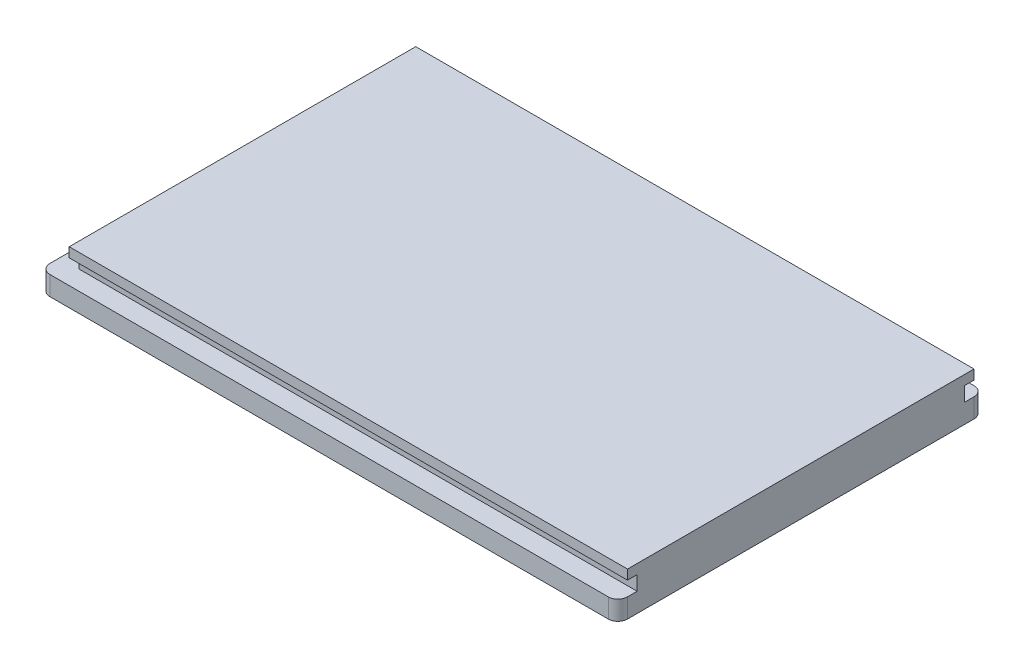
ISO-10303-21;
HEADER;
FILE_DESCRIPTION(('STEP AP214'),'2;1');
FILE_NAME('part.step','',(''),(''),'','','');
FILE_SCHEMA(('AUTOMOTIVE_DESIGN { 1 0 10303 214 1 1 1 1 }'));
ENDSEC;
DATA;
#1=APPLICATION_CONTEXT('core data for automotive mechanical design processes');
#2=APPLICATION_PROTOCOL_DEFINITION('international standard','automotive_design',2000,#1);
#3=PRODUCT_CONTEXT('',#1,'mechanical');
#4=PRODUCT('Part','Part','',(#3));
#5=PRODUCT_RELATED_PRODUCT_CATEGORY('part','',(#4));
#6=PRODUCT_DEFINITION_FORMATION('','',#4);
#7=PRODUCT_DEFINITION_CONTEXT('part definition',#1,'design');
#8=PRODUCT_DEFINITION('design','',#6,#7);
#9=PRODUCT_DEFINITION_SHAPE('','',#8);
#10=(LENGTH_UNIT() NAMED_UNIT(*) SI_UNIT(.MILLI.,.METRE.));
#11=(NAMED_UNIT(*) PLANE_ANGLE_UNIT() SI_UNIT($,.RADIAN.));
#12=(NAMED_UNIT(*) SI_UNIT($,.STERADIAN.) SOLID_ANGLE_UNIT());
#13=UNCERTAINTY_MEASURE_WITH_UNIT(LENGTH_MEASURE(1.E-05),#10,'distance_accuracy_value','');
#14=(GEOMETRIC_REPRESENTATION_CONTEXT(3) GLOBAL_UNCERTAINTY_ASSIGNED_CONTEXT((#13)) GLOBAL_UNIT_ASSIGNED_CONTEXT((#10,
#11,#12)) REPRESENTATION_CONTEXT('',''));
#15=CARTESIAN_POINT('',(0.,0.,0.));
#16=DIRECTION('',(0.,0.,1.));
#17=DIRECTION('',(1.,0.,0.));
#18=AXIS2_PLACEMENT_3D('',#15,#16,#17);
#19=CARTESIAN_POINT('',(0.,5.,0.));
#20=DIRECTION('',(0.,-1.,0.));
#21=DIRECTION('',(0.,0.,-1.));
#22=AXIS2_PLACEMENT_3D('',#19,#20,#21);
#23=PLANE('',#22);
#24=DIRECTION('',(1.,0.,0.));
#25=VECTOR('',#24,1.);
#26=CARTESIAN_POINT('',(0.,5.,0.));
#27=LINE('',#26,#25);
#28=CARTESIAN_POINT('',(2.5,5.,0.));
#29=VERTEX_POINT('',#28);
#30=CARTESIAN_POINT('',(147.5,5.,0.));
#31=VERTEX_POINT('',#30);
#32=EDGE_CURVE('E207',#29,#31,#27,.T.);
#33=ORIENTED_EDGE('',*,*,#32,.T.);
#34=CARTESIAN_POINT('',(147.5,5.,-2.5));
#35=DIRECTION('',(0.,-1.,0.));
#36=DIRECTION('',(0.,0.,-1.));
#37=AXIS2_PLACEMENT_3D('',#34,#35,#36);
#38=CIRCLE('',#37,2.5);
#39=CARTESIAN_POINT('',(150.,5.,-2.5));
#40=VERTEX_POINT('',#39);
#41=EDGE_CURVE('E248',#31,#40,#38,.F.);
#42=ORIENTED_EDGE('',*,*,#41,.T.);
#43=DIRECTION('',(0.,0.,-1.));
#44=VECTOR('',#43,1.);
#45=CARTESIAN_POINT('',(150.,5.,0.));
#46=LINE('',#45,#44);
#47=CARTESIAN_POINT('',(150.,5.,-5.00000000000001));
#48=VERTEX_POINT('',#47);
#49=EDGE_CURVE('E212',#40,#48,#46,.T.);
#50=ORIENTED_EDGE('',*,*,#49,.T.);
#51=DIRECTION('',(1.,0.,0.));
#52=VECTOR('',#51,1.);
#53=CARTESIAN_POINT('',(150.,5.,-5.00000000000001));
#54=LINE('',#53,#52);
#55=CARTESIAN_POINT('',(5.,5.,-5.00000000000001));
#56=VERTEX_POINT('',#55);
#57=EDGE_CURVE('E175',#56,#48,#54,.T.);
#58=ORIENTED_EDGE('',*,*,#57,.F.);
#59=DIRECTION('',(0.,0.,1.));
#60=VECTOR('',#59,1.);
#61=CARTESIAN_POINT('',(5.,5.,-90.));
#62=LINE('',#61,#60);
#63=CARTESIAN_POINT('',(5.,5.,-90.));
#64=VERTEX_POINT('',#63);
#65=EDGE_CURVE('E173',#64,#56,#62,.T.);
#66=ORIENTED_EDGE('',*,*,#65,.F.);
#67=DIRECTION('',(-1.,0.,0.));
#68=VECTOR('',#67,1.);
#69=CARTESIAN_POINT('',(5.,5.,-90.));
#70=LINE('',#69,#68);
#71=CARTESIAN_POINT('',(150.,5.,-90.));
#72=VERTEX_POINT('',#71);
#73=EDGE_CURVE('E185',#72,#64,#70,.T.);
#74=ORIENTED_EDGE('',*,*,#73,.F.);
#75=CARTESIAN_POINT('',(150.,5.,-92.5));
#76=VERTEX_POINT('',#75);
#77=EDGE_CURVE('E211',#72,#76,#46,.T.);
#78=ORIENTED_EDGE('',*,*,#77,.T.);
#79=CARTESIAN_POINT('',(147.5,5.,-92.5));
#80=DIRECTION('',(0.,-1.,0.));
#81=DIRECTION('',(0.,0.,-1.));
#82=AXIS2_PLACEMENT_3D('',#79,#80,#81);
#83=CIRCLE('',#82,2.5);
#84=CARTESIAN_POINT('',(147.5,5.,-95.));
#85=VERTEX_POINT('',#84);
#86=EDGE_CURVE('E246',#76,#85,#83,.F.);
#87=ORIENTED_EDGE('',*,*,#86,.T.);
#88=DIRECTION('',(-1.,0.,0.));
#89=VECTOR('',#88,1.);
#90=CARTESIAN_POINT('',(0.,5.,-95.));
#91=LINE('',#90,#89);
#92=CARTESIAN_POINT('',(2.5,5.,-95.));
#93=VERTEX_POINT('',#92);
#94=EDGE_CURVE('E214',#85,#93,#91,.T.);
#95=ORIENTED_EDGE('',*,*,#94,.T.);
#96=CARTESIAN_POINT('',(2.5,5.,-92.5));
#97=DIRECTION('',(0.,-1.,0.));
#98=DIRECTION('',(0.,0.,-1.));
#99=AXIS2_PLACEMENT_3D('',#96,#97,#98);
#100=CIRCLE('',#99,2.5);
#101=CARTESIAN_POINT('',(0.,5.,-92.5));
#102=VERTEX_POINT('',#101);
#103=EDGE_CURVE('E53',#93,#102,#100,.F.);
#104=ORIENTED_EDGE('',*,*,#103,.T.);
#105=DIRECTION('',(0.,0.,1.));
#106=VECTOR('',#105,1.);
#107=CARTESIAN_POINT('',(0.,5.,0.));
#108=LINE('',#107,#106);
#109=CARTESIAN_POINT('',(0.,5.,-2.5));
#110=VERTEX_POINT('',#109);
#111=EDGE_CURVE('E205',#102,#110,#108,.T.);
#112=ORIENTED_EDGE('',*,*,#111,.T.);
#113=CARTESIAN_POINT('',(2.5,5.,-2.5));
#114=DIRECTION('',(0.,-1.,0.));
#115=DIRECTION('',(0.,0.,-1.));
#116=AXIS2_PLACEMENT_3D('',#113,#114,#115);
#117=CIRCLE('',#116,2.5);
#118=EDGE_CURVE('E244',#110,#29,#117,.F.);
#119=ORIENTED_EDGE('',*,*,#118,.T.);
#120=EDGE_LOOP('',(#33,#42,#50,#58,#66,#74,#78,#87,#95,#104,#112,#119));
#121=FACE_BOUND('',#120,.T.);
#122=ADVANCED_FACE('F33',(#121),#23,.F.);
#123=CARTESIAN_POINT('',(0.,5.,0.));
#124=DIRECTION('',(1.,0.,0.));
#125=DIRECTION('',(0.,0.,-1.));
#126=AXIS2_PLACEMENT_3D('',#123,#124,#125);
#127=PLANE('',#126);
#128=DIRECTION('',(0.,0.,1.));
#129=VECTOR('',#128,1.);
#130=CARTESIAN_POINT('',(0.,0.,0.));
#131=LINE('',#130,#129);
#132=CARTESIAN_POINT('',(0.,0.,-92.5));
#133=VERTEX_POINT('',#132);
#134=CARTESIAN_POINT('',(0.,0.,-2.5));
#135=VERTEX_POINT('',#134);
#136=EDGE_CURVE('E204',#133,#135,#131,.T.);
#137=ORIENTED_EDGE('',*,*,#136,.T.);
#138=DIRECTION('',(0.,-1.,0.));
#139=VECTOR('',#138,1.);
#140=CARTESIAN_POINT('',(0.,5.,-2.5));
#141=LINE('',#140,#139);
#142=EDGE_CURVE('E11',#135,#110,#141,.F.);
#143=ORIENTED_EDGE('',*,*,#142,.T.);
#144=ORIENTED_EDGE('',*,*,#111,.F.);
#145=DIRECTION('',(0.,-1.,0.));
#146=VECTOR('',#145,1.);
#147=CARTESIAN_POINT('',(0.,5.,-92.5));
#148=LINE('',#147,#146);
#149=EDGE_CURVE('E41',#102,#133,#148,.T.);
#150=ORIENTED_EDGE('',*,*,#149,.T.);
#151=EDGE_LOOP('',(#137,#143,#144,#150));
#152=FACE_BOUND('',#151,.T.);
#153=ADVANCED_FACE('F257',(#152),#127,.F.);
#154=CARTESIAN_POINT('',(0.,5.,0.));
#155=DIRECTION('',(0.,0.,-1.));
#156=DIRECTION('',(-1.,0.,0.));
#157=AXIS2_PLACEMENT_3D('',#154,#155,#156);
#158=PLANE('',#157);
#159=DIRECTION('',(1.,0.,0.));
#160=VECTOR('',#159,1.);
#161=CARTESIAN_POINT('',(0.,0.,0.));
#162=LINE('',#161,#160);
#163=CARTESIAN_POINT('',(2.5,0.,0.));
#164=VERTEX_POINT('',#163);
#165=CARTESIAN_POINT('',(147.5,0.,0.));
#166=VERTEX_POINT('',#165);
#167=EDGE_CURVE('E218',#164,#166,#162,.T.);
#168=ORIENTED_EDGE('',*,*,#167,.T.);
#169=DIRECTION('',(0.,-1.,0.));
#170=VECTOR('',#169,1.);
#171=CARTESIAN_POINT('',(147.5,5.,0.));
#172=LINE('',#171,#170);
#173=EDGE_CURVE('E241',#166,#31,#172,.F.);
#174=ORIENTED_EDGE('',*,*,#173,.T.);
#175=ORIENTED_EDGE('',*,*,#32,.F.);
#176=DIRECTION('',(0.,-1.,0.));
#177=VECTOR('',#176,1.);
#178=CARTESIAN_POINT('',(2.5,5.,0.));
#179=LINE('',#178,#177);
#180=EDGE_CURVE('E238',#29,#164,#179,.T.);
#181=ORIENTED_EDGE('',*,*,#180,.T.);
#182=EDGE_LOOP('',(#168,#174,#175,#181));
#183=FACE_BOUND('',#182,.T.);
#184=ADVANCED_FACE('F270',(#183),#158,.F.);
#185=CARTESIAN_POINT('',(150.,5.,0.));
#186=DIRECTION('',(-1.,0.,0.));
#187=DIRECTION('',(0.,0.,1.));
#188=AXIS2_PLACEMENT_3D('',#185,#186,#187);
#189=PLANE('',#188);
#190=ORIENTED_EDGE('',*,*,#49,.F.);
#191=DIRECTION('',(0.,-1.,0.));
#192=VECTOR('',#191,1.);
#193=CARTESIAN_POINT('',(150.,5.,-2.5));
#194=LINE('',#193,#192);
#195=CARTESIAN_POINT('',(150.,0.,-2.5));
#196=VERTEX_POINT('',#195);
#197=EDGE_CURVE('E227',#40,#196,#194,.T.);
#198=ORIENTED_EDGE('',*,*,#197,.T.);
#199=DIRECTION('',(0.,0.,-1.));
#200=VECTOR('',#199,1.);
#201=CARTESIAN_POINT('',(150.,0.,0.));
#202=LINE('',#201,#200);
#203=CARTESIAN_POINT('',(150.,0.,-92.5));
#204=VERTEX_POINT('',#203);
#205=EDGE_CURVE('E221',#196,#204,#202,.T.);
#206=ORIENTED_EDGE('',*,*,#205,.T.);
#207=DIRECTION('',(0.,-1.,0.));
#208=VECTOR('',#207,1.);
#209=CARTESIAN_POINT('',(150.,5.,-92.5));
#210=LINE('',#209,#208);
#211=EDGE_CURVE('E216',#204,#76,#210,.F.);
#212=ORIENTED_EDGE('',*,*,#211,.T.);
#213=ORIENTED_EDGE('',*,*,#77,.F.);
#214=DIRECTION('',(0.,-1.,0.));
#215=VECTOR('',#214,1.);
#216=CARTESIAN_POINT('',(150.,8.75,-90.));
#217=LINE('',#216,#215);
#218=CARTESIAN_POINT('',(150.,8.75,-90.));
#219=VERTEX_POINT('',#218);
#220=EDGE_CURVE('E195',#219,#72,#217,.T.);
#221=ORIENTED_EDGE('',*,*,#220,.F.);
#222=DIRECTION('',(0.,0.,-1.));
#223=VECTOR('',#222,1.);
#224=CARTESIAN_POINT('',(150.,8.75,-2.50000000000001));
#225=LINE('',#224,#223);
#226=CARTESIAN_POINT('',(150.,8.75,-92.5));
#227=VERTEX_POINT('',#226);
#228=EDGE_CURVE('E455',#219,#227,#225,.T.);
#229=ORIENTED_EDGE('',*,*,#228,.T.);
#230=DIRECTION('',(0.,-1.,0.));
#231=VECTOR('',#230,1.);
#232=CARTESIAN_POINT('',(150.,11.25,-92.5));
#233=LINE('',#232,#231);
#234=CARTESIAN_POINT('',(150.,11.25,-92.5));
#235=VERTEX_POINT('',#234);
#236=EDGE_CURVE('E461',#235,#227,#233,.T.);
#237=ORIENTED_EDGE('',*,*,#236,.F.);
#238=DIRECTION('',(0.,0.,-1.));
#239=VECTOR('',#238,1.);
#240=CARTESIAN_POINT('',(150.,11.25,-2.50000000000001));
#241=LINE('',#240,#239);
#242=CARTESIAN_POINT('',(150.,11.25,-2.50000000000001));
#243=VERTEX_POINT('',#242);
#244=EDGE_CURVE('E164',#243,#235,#241,.T.);
#245=ORIENTED_EDGE('',*,*,#244,.F.);
#246=DIRECTION('',(0.,-1.,0.));
#247=VECTOR('',#246,1.);
#248=CARTESIAN_POINT('',(150.,11.25,-2.50000000000001));
#249=LINE('',#248,#247);
#250=CARTESIAN_POINT('',(150.,8.75,-2.50000000000001));
#251=VERTEX_POINT('',#250);
#252=EDGE_CURVE('E177',#243,#251,#249,.T.);
#253=ORIENTED_EDGE('',*,*,#252,.T.);
#254=CARTESIAN_POINT('',(150.,8.75,-5.00000000000001));
#255=VERTEX_POINT('',#254);
#256=EDGE_CURVE('E168',#251,#255,#225,.T.);
#257=ORIENTED_EDGE('',*,*,#256,.T.);
#258=DIRECTION('',(0.,-1.,0.));
#259=VECTOR('',#258,1.);
#260=CARTESIAN_POINT('',(150.,8.75,-5.00000000000001));
#261=LINE('',#260,#259);
#262=EDGE_CURVE('E198',#255,#48,#261,.T.);
#263=ORIENTED_EDGE('',*,*,#262,.T.);
#264=EDGE_LOOP('',(#190,#198,#206,#212,#213,#221,#229,#237,#245,#253,#257,#263));
#265=FACE_BOUND('',#264,.T.);
#266=ADVANCED_FACE('F278',(#265),#189,.F.);
#267=CARTESIAN_POINT('',(0.,5.,-95.));
#268=DIRECTION('',(0.,0.,1.));
#269=DIRECTION('',(1.,0.,0.));
#270=AXIS2_PLACEMENT_3D('',#267,#268,#269);
#271=PLANE('',#270);
#272=ORIENTED_EDGE('',*,*,#94,.F.);
#273=DIRECTION('',(0.,-1.,0.));
#274=VECTOR('',#273,1.);
#275=CARTESIAN_POINT('',(147.5,5.,-95.));
#276=LINE('',#275,#274);
#277=CARTESIAN_POINT('',(147.5,0.,-95.));
#278=VERTEX_POINT('',#277);
#279=EDGE_CURVE('E252',#85,#278,#276,.T.);
#280=ORIENTED_EDGE('',*,*,#279,.T.);
#281=DIRECTION('',(-1.,0.,0.));
#282=VECTOR('',#281,1.);
#283=CARTESIAN_POINT('',(0.,0.,-95.));
#284=LINE('',#283,#282);
#285=CARTESIAN_POINT('',(2.5,0.,-95.));
#286=VERTEX_POINT('',#285);
#287=EDGE_CURVE('E208',#278,#286,#284,.T.);
#288=ORIENTED_EDGE('',*,*,#287,.T.);
#289=DIRECTION('',(0.,-1.,0.));
#290=VECTOR('',#289,1.);
#291=CARTESIAN_POINT('',(2.5,5.,-95.));
#292=LINE('',#291,#290);
#293=EDGE_CURVE('E250',#286,#93,#292,.F.);
#294=ORIENTED_EDGE('',*,*,#293,.T.);
#295=EDGE_LOOP('',(#272,#280,#288,#294));
#296=FACE_BOUND('',#295,.T.);
#297=ADVANCED_FACE('F286',(#296),#271,.F.);
#298=CARTESIAN_POINT('',(0.,0.,0.));
#299=DIRECTION('',(0.,-1.,0.));
#300=DIRECTION('',(0.,0.,-1.));
#301=AXIS2_PLACEMENT_3D('',#298,#299,#300);
#302=PLANE('',#301);
#303=ORIENTED_EDGE('',*,*,#205,.F.);
#304=CARTESIAN_POINT('',(147.5,0.,-2.5));
#305=DIRECTION('',(0.,-1.,0.));
#306=DIRECTION('',(0.,0.,-1.));
#307=AXIS2_PLACEMENT_3D('',#304,#305,#306);
#308=CIRCLE('',#307,2.5);
#309=EDGE_CURVE('E236',#196,#166,#308,.T.);
#310=ORIENTED_EDGE('',*,*,#309,.T.);
#311=ORIENTED_EDGE('',*,*,#167,.F.);
#312=CARTESIAN_POINT('',(2.5,0.,-2.5));
#313=DIRECTION('',(0.,-1.,0.));
#314=DIRECTION('',(0.,0.,-1.));
#315=AXIS2_PLACEMENT_3D('',#312,#313,#314);
#316=CIRCLE('',#315,2.5);
#317=EDGE_CURVE('E232',#164,#135,#316,.T.);
#318=ORIENTED_EDGE('',*,*,#317,.T.);
#319=ORIENTED_EDGE('',*,*,#136,.F.);
#320=CARTESIAN_POINT('',(2.5,0.,-92.5));
#321=DIRECTION('',(0.,-1.,0.));
#322=DIRECTION('',(0.,0.,-1.));
#323=AXIS2_PLACEMENT_3D('',#320,#321,#322);
#324=CIRCLE('',#323,2.5);
#325=EDGE_CURVE('E230',#133,#286,#324,.T.);
#326=ORIENTED_EDGE('',*,*,#325,.T.);
#327=ORIENTED_EDGE('',*,*,#287,.F.);
#328=CARTESIAN_POINT('',(147.5,0.,-92.5));
#329=DIRECTION('',(0.,-1.,0.));
#330=DIRECTION('',(0.,0.,-1.));
#331=AXIS2_PLACEMENT_3D('',#328,#329,#330);
#332=CIRCLE('',#331,2.5);
#333=EDGE_CURVE('E234',#278,#204,#332,.T.);
#334=ORIENTED_EDGE('',*,*,#333,.T.);
#335=EDGE_LOOP('',(#303,#310,#311,#318,#319,#326,#327,#334));
#336=FACE_BOUND('',#335,.T.);
#337=ADVANCED_FACE('F261',(#336),#302,.T.);
#338=CARTESIAN_POINT('',(5.,8.75,-90.));
#339=DIRECTION('',(1.,0.,0.));
#340=DIRECTION('',(0.,0.,-1.));
#341=AXIS2_PLACEMENT_3D('',#338,#339,#340);
#342=PLANE('',#341);
#343=ORIENTED_EDGE('',*,*,#65,.T.);
#344=DIRECTION('',(0.,-1.,0.));
#345=VECTOR('',#344,1.);
#346=CARTESIAN_POINT('',(5.,8.75,-5.00000000000001));
#347=LINE('',#346,#345);
#348=CARTESIAN_POINT('',(5.,8.75,-5.00000000000001));
#349=VERTEX_POINT('',#348);
#350=EDGE_CURVE('E201',#349,#56,#347,.T.);
#351=ORIENTED_EDGE('',*,*,#350,.F.);
#352=DIRECTION('',(0.,0.,1.));
#353=VECTOR('',#352,1.);
#354=CARTESIAN_POINT('',(5.,8.75,-2.50000000000001));
#355=LINE('',#354,#353);
#356=CARTESIAN_POINT('',(5.,8.75,-2.50000000000001));
#357=VERTEX_POINT('',#356);
#358=EDGE_CURVE('E465',#349,#357,#355,.T.);
#359=ORIENTED_EDGE('',*,*,#358,.T.);
#360=DIRECTION('',(0.,-1.,0.));
#361=VECTOR('',#360,1.);
#362=CARTESIAN_POINT('',(5.,11.25,-2.50000000000001));
#363=LINE('',#362,#361);
#364=CARTESIAN_POINT('',(5.,11.25,-2.50000000000001));
#365=VERTEX_POINT('',#364);
#366=EDGE_CURVE('E155',#365,#357,#363,.T.);
#367=ORIENTED_EDGE('',*,*,#366,.F.);
#368=DIRECTION('',(0.,0.,1.));
#369=VECTOR('',#368,1.);
#370=CARTESIAN_POINT('',(5.,11.25,-2.50000000000001));
#371=LINE('',#370,#369);
#372=CARTESIAN_POINT('',(5.,11.25,-92.5));
#373=VERTEX_POINT('',#372);
#374=EDGE_CURVE('E146',#373,#365,#371,.T.);
#375=ORIENTED_EDGE('',*,*,#374,.F.);
#376=DIRECTION('',(0.,-1.,0.));
#377=VECTOR('',#376,1.);
#378=CARTESIAN_POINT('',(5.,11.25,-92.5));
#379=LINE('',#378,#377);
#380=CARTESIAN_POINT('',(5.,8.75,-92.5));
#381=VERTEX_POINT('',#380);
#382=EDGE_CURVE('E152',#373,#381,#379,.T.);
#383=ORIENTED_EDGE('',*,*,#382,.T.);
#384=CARTESIAN_POINT('',(5.,8.75,-90.));
#385=VERTEX_POINT('',#384);
#386=EDGE_CURVE('E466',#381,#385,#355,.T.);
#387=ORIENTED_EDGE('',*,*,#386,.T.);
#388=DIRECTION('',(0.,-1.,0.));
#389=VECTOR('',#388,1.);
#390=CARTESIAN_POINT('',(5.,8.75,-90.));
#391=LINE('',#390,#389);
#392=EDGE_CURVE('E187',#385,#64,#391,.T.);
#393=ORIENTED_EDGE('',*,*,#392,.T.);
#394=EDGE_LOOP('',(#343,#351,#359,#367,#375,#383,#387,#393));
#395=FACE_BOUND('',#394,.T.);
#396=ADVANCED_FACE('F149',(#395),#342,.F.);
#397=CARTESIAN_POINT('',(150.,8.75,-5.00000000000001));
#398=DIRECTION('',(0.,0.,-1.));
#399=DIRECTION('',(-1.,0.,0.));
#400=AXIS2_PLACEMENT_3D('',#397,#398,#399);
#401=PLANE('',#400);
#402=ORIENTED_EDGE('',*,*,#57,.T.);
#403=ORIENTED_EDGE('',*,*,#262,.F.);
#404=DIRECTION('',(1.,0.,0.));
#405=VECTOR('',#404,1.);
#406=CARTESIAN_POINT('',(150.,8.75,-5.00000000000001));
#407=LINE('',#406,#405);
#408=EDGE_CURVE('E181',#349,#255,#407,.T.);
#409=ORIENTED_EDGE('',*,*,#408,.F.);
#410=ORIENTED_EDGE('',*,*,#350,.T.);
#411=EDGE_LOOP('',(#402,#403,#409,#410));
#412=FACE_BOUND('',#411,.T.);
#413=ADVANCED_FACE('F385',(#412),#401,.F.);
#414=CARTESIAN_POINT('',(5.,8.75,-90.));
#415=DIRECTION('',(0.,0.,1.));
#416=DIRECTION('',(1.,0.,0.));
#417=AXIS2_PLACEMENT_3D('',#414,#415,#416);
#418=PLANE('',#417);
#419=ORIENTED_EDGE('',*,*,#73,.T.);
#420=ORIENTED_EDGE('',*,*,#392,.F.);
#421=DIRECTION('',(-1.,0.,0.));
#422=VECTOR('',#421,1.);
#423=CARTESIAN_POINT('',(5.,8.75,-90.));
#424=LINE('',#423,#422);
#425=EDGE_CURVE('E184',#219,#385,#424,.T.);
#426=ORIENTED_EDGE('',*,*,#425,.F.);
#427=ORIENTED_EDGE('',*,*,#220,.T.);
#428=EDGE_LOOP('',(#419,#420,#426,#427));
#429=FACE_BOUND('',#428,.T.);
#430=ADVANCED_FACE('F375',(#429),#418,.F.);
#431=CARTESIAN_POINT('',(0.,8.75,0.));
#432=DIRECTION('',(0.,1.,0.));
#433=DIRECTION('',(0.,0.,1.));
#434=AXIS2_PLACEMENT_3D('',#431,#432,#433);
#435=PLANE('',#434);
#436=ORIENTED_EDGE('',*,*,#358,.F.);
#437=ORIENTED_EDGE('',*,*,#408,.T.);
#438=ORIENTED_EDGE('',*,*,#256,.F.);
#439=DIRECTION('',(1.,0.,0.));
#440=VECTOR('',#439,1.);
#441=CARTESIAN_POINT('',(5.,8.75,-2.50000000000001));
#442=LINE('',#441,#440);
#443=EDGE_CURVE('E457',#357,#251,#442,.T.);
#444=ORIENTED_EDGE('',*,*,#443,.F.);
#445=EDGE_LOOP('',(#436,#437,#438,#444));
#446=FACE_BOUND('',#445,.T.);
#447=ADVANCED_FACE('F366',(#446),#435,.F.);
#448=ORIENTED_EDGE('',*,*,#228,.F.);
#449=ORIENTED_EDGE('',*,*,#425,.T.);
#450=ORIENTED_EDGE('',*,*,#386,.F.);
#451=DIRECTION('',(-1.,0.,0.));
#452=VECTOR('',#451,1.);
#453=CARTESIAN_POINT('',(5.,8.75,-92.5));
#454=LINE('',#453,#452);
#455=EDGE_CURVE('E172',#227,#381,#454,.T.);
#456=ORIENTED_EDGE('',*,*,#455,.F.);
#457=EDGE_LOOP('',(#448,#449,#450,#456));
#458=FACE_BOUND('',#457,.T.);
#459=ADVANCED_FACE('F358',(#458),#435,.F.);
#460=CARTESIAN_POINT('',(5.,11.25,-92.5));
#461=DIRECTION('',(0.,0.,1.));
#462=DIRECTION('',(1.,0.,0.));
#463=AXIS2_PLACEMENT_3D('',#460,#461,#462);
#464=PLANE('',#463);
#465=ORIENTED_EDGE('',*,*,#455,.T.);
#466=ORIENTED_EDGE('',*,*,#382,.F.);
#467=DIRECTION('',(-1.,0.,0.));
#468=VECTOR('',#467,1.);
#469=CARTESIAN_POINT('',(5.,11.25,-92.5));
#470=LINE('',#469,#468);
#471=EDGE_CURVE('E159',#235,#373,#470,.T.);
#472=ORIENTED_EDGE('',*,*,#471,.F.);
#473=ORIENTED_EDGE('',*,*,#236,.T.);
#474=EDGE_LOOP('',(#465,#466,#472,#473));
#475=FACE_BOUND('',#474,.T.);
#476=ADVANCED_FACE('F170',(#475),#464,.F.);
#477=CARTESIAN_POINT('',(5.,11.25,-2.50000000000001));
#478=DIRECTION('',(0.,0.,-1.));
#479=DIRECTION('',(-1.,0.,0.));
#480=AXIS2_PLACEMENT_3D('',#477,#478,#479);
#481=PLANE('',#480);
#482=ORIENTED_EDGE('',*,*,#443,.T.);
#483=ORIENTED_EDGE('',*,*,#252,.F.);
#484=DIRECTION('',(1.,0.,0.));
#485=VECTOR('',#484,1.);
#486=CARTESIAN_POINT('',(5.,11.25,-2.50000000000001));
#487=LINE('',#486,#485);
#488=EDGE_CURVE('E158',#365,#243,#487,.T.);
#489=ORIENTED_EDGE('',*,*,#488,.F.);
#490=ORIENTED_EDGE('',*,*,#366,.T.);
#491=EDGE_LOOP('',(#482,#483,#489,#490));
#492=FACE_BOUND('',#491,.T.);
#493=ADVANCED_FACE('F342',(#492),#481,.F.);
#494=CARTESIAN_POINT('',(0.,11.25,0.));
#495=DIRECTION('',(0.,1.,0.));
#496=DIRECTION('',(0.,0.,1.));
#497=AXIS2_PLACEMENT_3D('',#494,#495,#496);
#498=PLANE('',#497);
#499=ORIENTED_EDGE('',*,*,#471,.T.);
#500=ORIENTED_EDGE('',*,*,#374,.T.);
#501=ORIENTED_EDGE('',*,*,#488,.T.);
#502=ORIENTED_EDGE('',*,*,#244,.T.);
#503=EDGE_LOOP('',(#499,#500,#501,#502));
#504=FACE_BOUND('',#503,.T.);
#505=ADVANCED_FACE('F162',(#504),#498,.T.);
#506=CARTESIAN_POINT('',(147.5,5.,-2.5));
#507=DIRECTION('',(0.,-1.,0.));
#508=DIRECTION('',(0.,0.,-1.));
#509=AXIS2_PLACEMENT_3D('',#506,#507,#508);
#510=CYLINDRICAL_SURFACE('',#509,2.5);
#511=ORIENTED_EDGE('',*,*,#41,.F.);
#512=ORIENTED_EDGE('',*,*,#173,.F.);
#513=ORIENTED_EDGE('',*,*,#309,.F.);
#514=ORIENTED_EDGE('',*,*,#197,.F.);
#515=EDGE_LOOP('',(#511,#512,#513,#514));
#516=FACE_BOUND('',#515,.T.);
#517=ADVANCED_FACE('F276',(#516),#510,.T.);
#518=CARTESIAN_POINT('',(147.5,5.,-92.5));
#519=DIRECTION('',(0.,-1.,0.));
#520=DIRECTION('',(0.,0.,-1.));
#521=AXIS2_PLACEMENT_3D('',#518,#519,#520);
#522=CYLINDRICAL_SURFACE('',#521,2.5);
#523=ORIENTED_EDGE('',*,*,#86,.F.);
#524=ORIENTED_EDGE('',*,*,#211,.F.);
#525=ORIENTED_EDGE('',*,*,#333,.F.);
#526=ORIENTED_EDGE('',*,*,#279,.F.);
#527=EDGE_LOOP('',(#523,#524,#525,#526));
#528=FACE_BOUND('',#527,.T.);
#529=ADVANCED_FACE('F283',(#528),#522,.T.);
#530=CARTESIAN_POINT('',(2.5,5.,-2.5));
#531=DIRECTION('',(0.,-1.,0.));
#532=DIRECTION('',(0.,0.,-1.));
#533=AXIS2_PLACEMENT_3D('',#530,#531,#532);
#534=CYLINDRICAL_SURFACE('',#533,2.5);
#535=ORIENTED_EDGE('',*,*,#118,.F.);
#536=ORIENTED_EDGE('',*,*,#142,.F.);
#537=ORIENTED_EDGE('',*,*,#317,.F.);
#538=ORIENTED_EDGE('',*,*,#180,.F.);
#539=EDGE_LOOP('',(#535,#536,#537,#538));
#540=FACE_BOUND('',#539,.T.);
#541=ADVANCED_FACE('F267',(#540),#534,.T.);
#542=CARTESIAN_POINT('',(2.5,5.,-92.5));
#543=DIRECTION('',(0.,-1.,0.));
#544=DIRECTION('',(0.,0.,-1.));
#545=AXIS2_PLACEMENT_3D('',#542,#543,#544);
#546=CYLINDRICAL_SURFACE('',#545,2.5);
#547=ORIENTED_EDGE('',*,*,#103,.F.);
#548=ORIENTED_EDGE('',*,*,#293,.F.);
#549=ORIENTED_EDGE('',*,*,#325,.F.);
#550=ORIENTED_EDGE('',*,*,#149,.F.);
#551=EDGE_LOOP('',(#547,#548,#549,#550));
#552=FACE_BOUND('',#551,.T.);
#553=ADVANCED_FACE('F35',(#552),#546,.T.);
#554=CLOSED_SHELL('',(#122,#153,#184,#266,#297,#337,#396,#413,#430,#447,#459,#476,#493,#505,
#517,#529,#541,#553));
#555=MANIFOLD_SOLID_BREP('B2',#554);
#556=ADVANCED_BREP_SHAPE_REPRESENTATION('',(#18,#555),#14);
#557=SHAPE_DEFINITION_REPRESENTATION(#9,#556);
ENDSEC;
END-ISO-10303-21;
